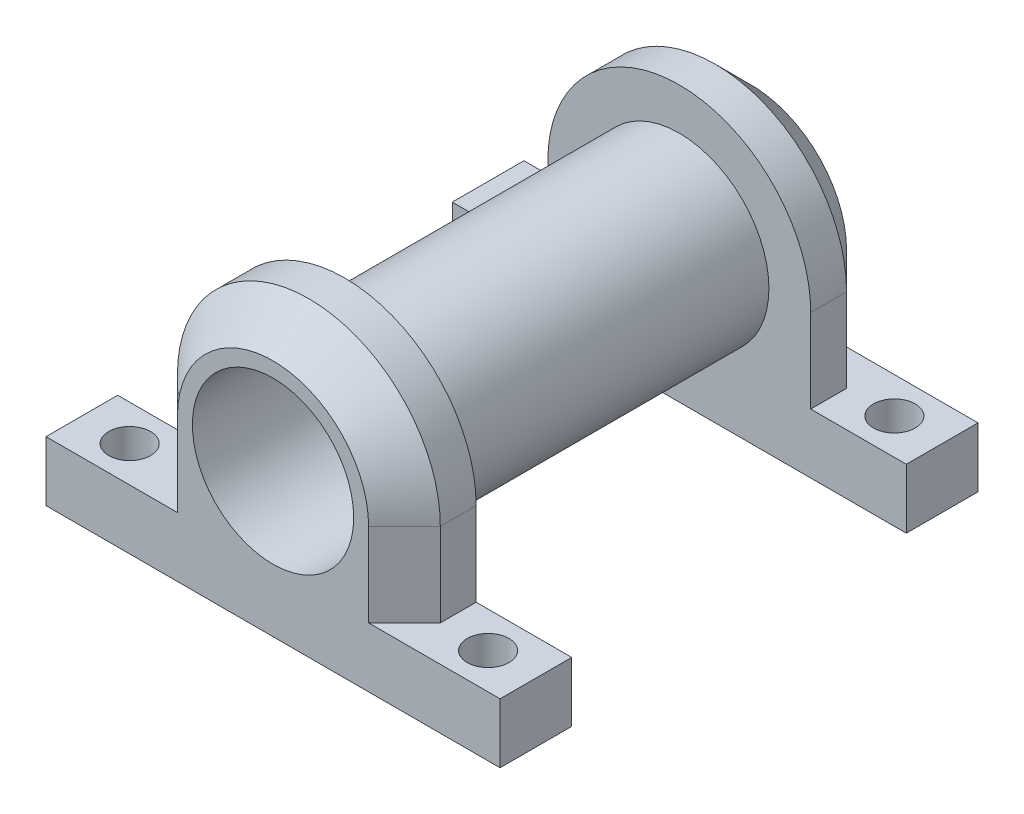
ISO-10303-21;
HEADER;
FILE_DESCRIPTION(('STEP AP214'),'2;1');
FILE_NAME('part.step','',(''),(''),'','','');
FILE_SCHEMA(('AUTOMOTIVE_DESIGN { 1 0 10303 214 1 1 1 1 }'));
ENDSEC;
DATA;
#1=APPLICATION_CONTEXT('core data for automotive mechanical design processes');
#2=APPLICATION_PROTOCOL_DEFINITION('international standard','automotive_design',2000,#1);
#3=PRODUCT_CONTEXT('',#1,'mechanical');
#4=PRODUCT('Part','Part','',(#3));
#5=PRODUCT_RELATED_PRODUCT_CATEGORY('part','',(#4));
#6=PRODUCT_DEFINITION_FORMATION('','',#4);
#7=PRODUCT_DEFINITION_CONTEXT('part definition',#1,'design');
#8=PRODUCT_DEFINITION('design','',#6,#7);
#9=PRODUCT_DEFINITION_SHAPE('','',#8);
#10=(LENGTH_UNIT() NAMED_UNIT(*) SI_UNIT(.MILLI.,.METRE.));
#11=(NAMED_UNIT(*) PLANE_ANGLE_UNIT() SI_UNIT($,.RADIAN.));
#12=(NAMED_UNIT(*) SI_UNIT($,.STERADIAN.) SOLID_ANGLE_UNIT());
#13=UNCERTAINTY_MEASURE_WITH_UNIT(LENGTH_MEASURE(1.E-05),#10,'distance_accuracy_value','');
#14=(GEOMETRIC_REPRESENTATION_CONTEXT(3) GLOBAL_UNCERTAINTY_ASSIGNED_CONTEXT((#13)) GLOBAL_UNIT_ASSIGNED_CONTEXT((#10,
#11,#12)) REPRESENTATION_CONTEXT('',''));
#15=CARTESIAN_POINT('',(0.,0.,0.));
#16=DIRECTION('',(0.,0.,1.));
#17=DIRECTION('',(1.,0.,0.));
#18=AXIS2_PLACEMENT_3D('',#15,#16,#17);
#19=CARTESIAN_POINT('',(-19.,-12.,6.));
#20=DIRECTION('',(1.,0.,0.));
#21=DIRECTION('',(0.,1.,0.));
#22=AXIS2_PLACEMENT_3D('',#19,#20,#21);
#23=PLANE('',#22);
#24=DIRECTION('',(0.,-1.,0.));
#25=VECTOR('',#24,1.);
#26=CARTESIAN_POINT('',(-19.,-12.,0.));
#27=LINE('',#26,#25);
#28=CARTESIAN_POINT('',(-19.,-7.,0.));
#29=VERTEX_POINT('',#28);
#30=CARTESIAN_POINT('',(-19.,-12.,0.));
#31=VERTEX_POINT('',#30);
#32=EDGE_CURVE('E216',#29,#31,#27,.T.);
#33=ORIENTED_EDGE('',*,*,#32,.T.);
#34=DIRECTION('',(0.,0.,-1.));
#35=VECTOR('',#34,1.);
#36=CARTESIAN_POINT('',(-19.,-12.,6.));
#37=LINE('',#36,#35);
#38=CARTESIAN_POINT('',(-19.,-12.,6.));
#39=VERTEX_POINT('',#38);
#40=EDGE_CURVE('E263',#39,#31,#37,.T.);
#41=ORIENTED_EDGE('',*,*,#40,.F.);
#42=DIRECTION('',(0.,-1.,0.));
#43=VECTOR('',#42,1.);
#44=CARTESIAN_POINT('',(-19.,-12.,6.));
#45=LINE('',#44,#43);
#46=CARTESIAN_POINT('',(-19.,-7.,6.));
#47=VERTEX_POINT('',#46);
#48=EDGE_CURVE('E218',#47,#39,#45,.T.);
#49=ORIENTED_EDGE('',*,*,#48,.F.);
#50=DIRECTION('',(0.,0.,-1.));
#51=VECTOR('',#50,1.);
#52=CARTESIAN_POINT('',(-19.,-7.,6.));
#53=LINE('',#52,#51);
#54=EDGE_CURVE('E236',#47,#29,#53,.T.);
#55=ORIENTED_EDGE('',*,*,#54,.T.);
#56=EDGE_LOOP('',(#33,#41,#49,#55));
#57=FACE_BOUND('',#56,.T.);
#58=ADVANCED_FACE('F39',(#57),#23,.F.);
#59=CARTESIAN_POINT('',(11.,-12.,6.));
#60=DIRECTION('',(0.,1.,0.));
#61=DIRECTION('',(-1.,0.,0.));
#62=AXIS2_PLACEMENT_3D('',#59,#60,#61);
#63=PLANE('',#62);
#64=CARTESIAN_POINT('',(15.,-12.,3.));
#65=DIRECTION('',(0.,1.,0.));
#66=DIRECTION('',(0.,0.,1.));
#67=AXIS2_PLACEMENT_3D('',#64,#65,#66);
#68=CIRCLE('',#67,1.75);
#69=CARTESIAN_POINT('',(15.,-12.,4.75));
#70=VERTEX_POINT('',#69);
#71=EDGE_CURVE('E732',#70,#70,#68,.T.);
#72=ORIENTED_EDGE('',*,*,#71,.T.);
#73=EDGE_LOOP('',(#72));
#74=FACE_BOUND('',#73,.T.);
#75=CARTESIAN_POINT('',(-15.,-12.,3.));
#76=DIRECTION('',(0.,1.,0.));
#77=DIRECTION('',(0.,0.,1.));
#78=AXIS2_PLACEMENT_3D('',#75,#76,#77);
#79=CIRCLE('',#78,1.75);
#80=CARTESIAN_POINT('',(-15.,-12.,4.75));
#81=VERTEX_POINT('',#80);
#82=EDGE_CURVE('E735',#81,#81,#79,.T.);
#83=ORIENTED_EDGE('',*,*,#82,.T.);
#84=EDGE_LOOP('',(#83));
#85=FACE_BOUND('',#84,.T.);
#86=DIRECTION('',(1.,0.,0.));
#87=VECTOR('',#86,1.);
#88=CARTESIAN_POINT('',(11.,-12.,0.));
#89=LINE('',#88,#87);
#90=CARTESIAN_POINT('',(19.,-12.,0.));
#91=VERTEX_POINT('',#90);
#92=EDGE_CURVE('E239',#31,#91,#89,.T.);
#93=ORIENTED_EDGE('',*,*,#92,.T.);
#94=DIRECTION('',(0.,0.,-1.));
#95=VECTOR('',#94,1.);
#96=CARTESIAN_POINT('',(19.,-12.,6.));
#97=LINE('',#96,#95);
#98=CARTESIAN_POINT('',(19.,-12.,6.));
#99=VERTEX_POINT('',#98);
#100=EDGE_CURVE('E260',#99,#91,#97,.T.);
#101=ORIENTED_EDGE('',*,*,#100,.F.);
#102=DIRECTION('',(1.,0.,0.));
#103=VECTOR('',#102,1.);
#104=CARTESIAN_POINT('',(-11.,-12.,6.));
#105=LINE('',#104,#103);
#106=EDGE_CURVE('E221',#39,#99,#105,.T.);
#107=ORIENTED_EDGE('',*,*,#106,.F.);
#108=ORIENTED_EDGE('',*,*,#40,.T.);
#109=EDGE_LOOP('',(#93,#101,#107,#108));
#110=FACE_BOUND('',#109,.T.);
#111=ADVANCED_FACE('F338',(#74,#85,#110),#63,.F.);
#112=CARTESIAN_POINT('',(19.,-12.,6.));
#113=DIRECTION('',(-1.,0.,0.));
#114=DIRECTION('',(0.,-1.,0.));
#115=AXIS2_PLACEMENT_3D('',#112,#113,#114);
#116=PLANE('',#115);
#117=DIRECTION('',(0.,1.,0.));
#118=VECTOR('',#117,1.);
#119=CARTESIAN_POINT('',(19.,-12.,0.));
#120=LINE('',#119,#118);
#121=CARTESIAN_POINT('',(19.,-7.,0.));
#122=VERTEX_POINT('',#121);
#123=EDGE_CURVE('E241',#91,#122,#120,.T.);
#124=ORIENTED_EDGE('',*,*,#123,.T.);
#125=DIRECTION('',(0.,0.,-1.));
#126=VECTOR('',#125,1.);
#127=CARTESIAN_POINT('',(19.,-7.,6.));
#128=LINE('',#127,#126);
#129=CARTESIAN_POINT('',(19.,-7.,6.));
#130=VERTEX_POINT('',#129);
#131=EDGE_CURVE('E257',#130,#122,#128,.T.);
#132=ORIENTED_EDGE('',*,*,#131,.F.);
#133=DIRECTION('',(0.,1.,0.));
#134=VECTOR('',#133,1.);
#135=CARTESIAN_POINT('',(19.,-12.,6.));
#136=LINE('',#135,#134);
#137=EDGE_CURVE('E224',#99,#130,#136,.T.);
#138=ORIENTED_EDGE('',*,*,#137,.F.);
#139=ORIENTED_EDGE('',*,*,#100,.T.);
#140=EDGE_LOOP('',(#124,#132,#138,#139));
#141=FACE_BOUND('',#140,.T.);
#142=ADVANCED_FACE('F344',(#141),#116,.F.);
#143=CARTESIAN_POINT('',(11.,-7.,6.));
#144=DIRECTION('',(0.,-1.,0.));
#145=DIRECTION('',(0.,0.,-1.));
#146=AXIS2_PLACEMENT_3D('',#143,#144,#145);
#147=PLANE('',#146);
#148=CARTESIAN_POINT('',(15.,-7.,3.));
#149=DIRECTION('',(0.,1.,0.));
#150=DIRECTION('',(0.,0.,1.));
#151=AXIS2_PLACEMENT_3D('',#148,#149,#150);
#152=CIRCLE('',#151,1.75);
#153=CARTESIAN_POINT('',(15.,-7.,4.75));
#154=VERTEX_POINT('',#153);
#155=EDGE_CURVE('E729',#154,#154,#152,.T.);
#156=ORIENTED_EDGE('',*,*,#155,.F.);
#157=EDGE_LOOP('',(#156));
#158=FACE_BOUND('',#157,.T.);
#159=DIRECTION('',(-1.,0.,0.));
#160=VECTOR('',#159,1.);
#161=CARTESIAN_POINT('',(11.,-7.,0.));
#162=LINE('',#161,#160);
#163=CARTESIAN_POINT('',(7.99999999999998,-7.,0.));
#164=VERTEX_POINT('',#163);
#165=EDGE_CURVE('E243',#122,#164,#162,.T.);
#166=ORIENTED_EDGE('',*,*,#165,.T.);
#167=DIRECTION('',(-0.707106781186549,0.,-0.707106781186546));
#168=VECTOR('',#167,1.);
#169=CARTESIAN_POINT('',(12.5,-7.,4.49999999999999));
#170=LINE('',#169,#168);
#171=CARTESIAN_POINT('',(11.,-7.,3.));
#172=VERTEX_POINT('',#171);
#173=EDGE_CURVE('E49',#164,#172,#170,.F.);
#174=ORIENTED_EDGE('',*,*,#173,.T.);
#175=DIRECTION('',(0.,0.,-1.));
#176=VECTOR('',#175,1.);
#177=CARTESIAN_POINT('',(11.,-7.,6.));
#178=LINE('',#177,#176);
#179=CARTESIAN_POINT('',(11.,-7.,6.));
#180=VERTEX_POINT('',#179);
#181=EDGE_CURVE('E254',#180,#172,#178,.T.);
#182=ORIENTED_EDGE('',*,*,#181,.F.);
#183=DIRECTION('',(-1.,0.,0.));
#184=VECTOR('',#183,1.);
#185=CARTESIAN_POINT('',(11.,-7.,6.));
#186=LINE('',#185,#184);
#187=EDGE_CURVE('E226',#130,#180,#186,.T.);
#188=ORIENTED_EDGE('',*,*,#187,.F.);
#189=ORIENTED_EDGE('',*,*,#131,.T.);
#190=EDGE_LOOP('',(#166,#174,#182,#188,#189));
#191=FACE_BOUND('',#190,.T.);
#192=ADVANCED_FACE('F334',(#158,#191),#147,.F.);
#193=CARTESIAN_POINT('',(11.,-7.,6.));
#194=DIRECTION('',(-1.,0.,0.));
#195=DIRECTION('',(0.,0.,1.));
#196=AXIS2_PLACEMENT_3D('',#193,#194,#195);
#197=PLANE('',#196);
#198=ORIENTED_EDGE('',*,*,#181,.T.);
#199=DIRECTION('',(0.,1.,0.));
#200=VECTOR('',#199,1.);
#201=CARTESIAN_POINT('',(11.,-7.,3.));
#202=LINE('',#201,#200);
#203=CARTESIAN_POINT('',(11.,0.,3.));
#204=VERTEX_POINT('',#203);
#205=EDGE_CURVE('E278',#172,#204,#202,.T.);
#206=ORIENTED_EDGE('',*,*,#205,.T.);
#207=DIRECTION('',(0.,0.,-1.));
#208=VECTOR('',#207,1.);
#209=CARTESIAN_POINT('',(11.,0.,6.));
#210=LINE('',#209,#208);
#211=CARTESIAN_POINT('',(11.,0.,6.));
#212=VERTEX_POINT('',#211);
#213=EDGE_CURVE('E252',#212,#204,#210,.T.);
#214=ORIENTED_EDGE('',*,*,#213,.F.);
#215=DIRECTION('',(0.,1.,0.));
#216=VECTOR('',#215,1.);
#217=CARTESIAN_POINT('',(11.,-7.,6.));
#218=LINE('',#217,#216);
#219=EDGE_CURVE('E228',#180,#212,#218,.T.);
#220=ORIENTED_EDGE('',*,*,#219,.F.);
#221=EDGE_LOOP('',(#198,#206,#214,#220));
#222=FACE_BOUND('',#221,.T.);
#223=ADVANCED_FACE('F327',(#222),#197,.F.);
#224=CARTESIAN_POINT('',(0.,0.,6.));
#225=DIRECTION('',(0.,0.,-1.));
#226=DIRECTION('',(-1.,0.,0.));
#227=AXIS2_PLACEMENT_3D('',#224,#225,#226);
#228=CYLINDRICAL_SURFACE('',#227,11.);
#229=ORIENTED_EDGE('',*,*,#213,.T.);
#230=CARTESIAN_POINT('',(0.,0.,3.));
#231=DIRECTION('',(0.,0.,1.));
#232=DIRECTION('',(1.,0.,0.));
#233=AXIS2_PLACEMENT_3D('',#230,#231,#232);
#234=CIRCLE('',#233,11.);
#235=CARTESIAN_POINT('',(-11.,0.,3.));
#236=VERTEX_POINT('',#235);
#237=EDGE_CURVE('E65',#204,#236,#234,.T.);
#238=ORIENTED_EDGE('',*,*,#237,.T.);
#239=DIRECTION('',(0.,0.,-1.));
#240=VECTOR('',#239,1.);
#241=CARTESIAN_POINT('',(-11.,0.,6.));
#242=LINE('',#241,#240);
#243=CARTESIAN_POINT('',(-11.,0.,6.));
#244=VERTEX_POINT('',#243);
#245=EDGE_CURVE('E250',#244,#236,#242,.T.);
#246=ORIENTED_EDGE('',*,*,#245,.F.);
#247=CARTESIAN_POINT('',(0.,0.,6.));
#248=DIRECTION('',(0.,0.,1.));
#249=DIRECTION('',(1.,0.,0.));
#250=AXIS2_PLACEMENT_3D('',#247,#248,#249);
#251=CIRCLE('',#250,11.);
#252=EDGE_CURVE('E230',#212,#244,#251,.T.);
#253=ORIENTED_EDGE('',*,*,#252,.F.);
#254=EDGE_LOOP('',(#229,#238,#246,#253));
#255=FACE_BOUND('',#254,.T.);
#256=ADVANCED_FACE('F325',(#255),#228,.T.);
#257=CARTESIAN_POINT('',(-11.,0.,6.));
#258=DIRECTION('',(1.,0.,0.));
#259=DIRECTION('',(0.,0.,-1.));
#260=AXIS2_PLACEMENT_3D('',#257,#258,#259);
#261=PLANE('',#260);
#262=ORIENTED_EDGE('',*,*,#245,.T.);
#263=DIRECTION('',(0.,-1.,0.));
#264=VECTOR('',#263,1.);
#265=CARTESIAN_POINT('',(-11.,0.,3.));
#266=LINE('',#265,#264);
#267=CARTESIAN_POINT('',(-11.,-7.,3.));
#268=VERTEX_POINT('',#267);
#269=EDGE_CURVE('E57',#236,#268,#266,.T.);
#270=ORIENTED_EDGE('',*,*,#269,.T.);
#271=DIRECTION('',(0.,0.,-1.));
#272=VECTOR('',#271,1.);
#273=CARTESIAN_POINT('',(-11.,-7.,6.));
#274=LINE('',#273,#272);
#275=CARTESIAN_POINT('',(-11.,-7.,6.));
#276=VERTEX_POINT('',#275);
#277=EDGE_CURVE('E248',#276,#268,#274,.T.);
#278=ORIENTED_EDGE('',*,*,#277,.F.);
#279=DIRECTION('',(0.,-1.,0.));
#280=VECTOR('',#279,1.);
#281=CARTESIAN_POINT('',(-11.,0.,6.));
#282=LINE('',#281,#280);
#283=EDGE_CURVE('E232',#244,#276,#282,.T.);
#284=ORIENTED_EDGE('',*,*,#283,.F.);
#285=EDGE_LOOP('',(#262,#270,#278,#284));
#286=FACE_BOUND('',#285,.T.);
#287=ADVANCED_FACE('F319',(#286),#261,.F.);
#288=CARTESIAN_POINT('',(-11.,-7.,6.));
#289=DIRECTION('',(0.,-1.,0.));
#290=DIRECTION('',(0.,0.,-1.));
#291=AXIS2_PLACEMENT_3D('',#288,#289,#290);
#292=PLANE('',#291);
#293=CARTESIAN_POINT('',(-15.,-7.,3.));
#294=DIRECTION('',(0.,1.,0.));
#295=DIRECTION('',(0.,0.,1.));
#296=AXIS2_PLACEMENT_3D('',#293,#294,#295);
#297=CIRCLE('',#296,1.75);
#298=CARTESIAN_POINT('',(-15.,-7.,4.75));
#299=VERTEX_POINT('',#298);
#300=EDGE_CURVE('E731',#299,#299,#297,.T.);
#301=ORIENTED_EDGE('',*,*,#300,.F.);
#302=EDGE_LOOP('',(#301));
#303=FACE_BOUND('',#302,.T.);
#304=DIRECTION('',(-1.,0.,0.));
#305=VECTOR('',#304,1.);
#306=CARTESIAN_POINT('',(-11.,-7.,0.));
#307=LINE('',#306,#305);
#308=CARTESIAN_POINT('',(-7.99999999999998,-7.,0.));
#309=VERTEX_POINT('',#308);
#310=EDGE_CURVE('E222',#309,#29,#307,.T.);
#311=ORIENTED_EDGE('',*,*,#310,.T.);
#312=ORIENTED_EDGE('',*,*,#54,.F.);
#313=DIRECTION('',(-1.,0.,0.));
#314=VECTOR('',#313,1.);
#315=CARTESIAN_POINT('',(-11.,-7.,6.));
#316=LINE('',#315,#314);
#317=EDGE_CURVE('E234',#276,#47,#316,.T.);
#318=ORIENTED_EDGE('',*,*,#317,.F.);
#319=ORIENTED_EDGE('',*,*,#277,.T.);
#320=DIRECTION('',(-0.707106781186549,0.,0.707106781186546));
#321=VECTOR('',#320,1.);
#322=CARTESIAN_POINT('',(-12.5,-7.,4.49999999999999));
#323=LINE('',#322,#321);
#324=EDGE_CURVE('E11',#268,#309,#323,.F.);
#325=ORIENTED_EDGE('',*,*,#324,.T.);
#326=EDGE_LOOP('',(#311,#312,#318,#319,#325));
#327=FACE_BOUND('',#326,.T.);
#328=ADVANCED_FACE('F315',(#303,#327),#292,.F.);
#329=CARTESIAN_POINT('',(0.,0.,6.));
#330=DIRECTION('',(0.,0.,1.));
#331=DIRECTION('',(1.,0.,0.));
#332=AXIS2_PLACEMENT_3D('',#329,#330,#331);
#333=PLANE('',#332);
#334=CARTESIAN_POINT('',(0.,0.,6.));
#335=DIRECTION('',(0.,0.,1.));
#336=DIRECTION('',(1.,0.,0.));
#337=AXIS2_PLACEMENT_3D('',#334,#335,#336);
#338=CIRCLE('',#337,7.5);
#339=CARTESIAN_POINT('',(7.5,0.,6.));
#340=VERTEX_POINT('',#339);
#341=EDGE_CURVE('E206',#340,#340,#338,.T.);
#342=ORIENTED_EDGE('',*,*,#341,.F.);
#343=EDGE_LOOP('',(#342));
#344=FACE_BOUND('',#343,.T.);
#345=ORIENTED_EDGE('',*,*,#48,.T.);
#346=ORIENTED_EDGE('',*,*,#106,.T.);
#347=ORIENTED_EDGE('',*,*,#137,.T.);
#348=ORIENTED_EDGE('',*,*,#187,.T.);
#349=ORIENTED_EDGE('',*,*,#219,.T.);
#350=ORIENTED_EDGE('',*,*,#252,.T.);
#351=ORIENTED_EDGE('',*,*,#283,.T.);
#352=ORIENTED_EDGE('',*,*,#317,.T.);
#353=EDGE_LOOP('',(#345,#346,#347,#348,#349,#350,#351,#352));
#354=FACE_BOUND('',#353,.T.);
#355=ADVANCED_FACE('F321',(#344,#354),#333,.T.);
#356=CARTESIAN_POINT('',(0.,0.,0.));
#357=DIRECTION('',(0.,0.,1.));
#358=DIRECTION('',(1.,0.,0.));
#359=AXIS2_PLACEMENT_3D('',#356,#357,#358);
#360=PLANE('',#359);
#361=CARTESIAN_POINT('',(0.,0.,0.));
#362=DIRECTION('',(0.,0.,1.));
#363=DIRECTION('',(1.,0.,0.));
#364=AXIS2_PLACEMENT_3D('',#361,#362,#363);
#365=CIRCLE('',#364,6.75);
#366=CARTESIAN_POINT('',(6.75,0.,0.));
#367=VERTEX_POINT('',#366);
#368=EDGE_CURVE('E752',#367,#367,#365,.T.);
#369=ORIENTED_EDGE('',*,*,#368,.T.);
#370=EDGE_LOOP('',(#369));
#371=FACE_BOUND('',#370,.T.);
#372=DIRECTION('',(0.,-1.,0.));
#373=VECTOR('',#372,1.);
#374=CARTESIAN_POINT('',(7.99999999999998,0.,0.));
#375=LINE('',#374,#373);
#376=CARTESIAN_POINT('',(7.99999999999998,0.,0.));
#377=VERTEX_POINT('',#376);
#378=EDGE_CURVE('E285',#377,#164,#375,.T.);
#379=ORIENTED_EDGE('',*,*,#378,.T.);
#380=ORIENTED_EDGE('',*,*,#165,.F.);
#381=ORIENTED_EDGE('',*,*,#123,.F.);
#382=ORIENTED_EDGE('',*,*,#92,.F.);
#383=ORIENTED_EDGE('',*,*,#32,.F.);
#384=ORIENTED_EDGE('',*,*,#310,.F.);
#385=DIRECTION('',(0.,1.,0.));
#386=VECTOR('',#385,1.);
#387=CARTESIAN_POINT('',(-7.99999999999998,0.,0.));
#388=LINE('',#387,#386);
#389=CARTESIAN_POINT('',(-7.99999999999998,0.,0.));
#390=VERTEX_POINT('',#389);
#391=EDGE_CURVE('E281',#309,#390,#388,.T.);
#392=ORIENTED_EDGE('',*,*,#391,.T.);
#393=CARTESIAN_POINT('',(0.,0.,0.));
#394=DIRECTION('',(0.,0.,1.));
#395=DIRECTION('',(1.,0.,0.));
#396=AXIS2_PLACEMENT_3D('',#393,#394,#395);
#397=CIRCLE('',#396,7.99999999999998);
#398=EDGE_CURVE('E283',#390,#377,#397,.F.);
#399=ORIENTED_EDGE('',*,*,#398,.T.);
#400=EDGE_LOOP('',(#379,#380,#381,#382,#383,#384,#392,#399));
#401=FACE_BOUND('',#400,.T.);
#402=ADVANCED_FACE('F522',(#371,#401),#360,.F.);
#403=CARTESIAN_POINT('',(0.,0.,34.));
#404=DIRECTION('',(0.,0.,-1.));
#405=DIRECTION('',(-1.,0.,0.));
#406=AXIS2_PLACEMENT_3D('',#403,#404,#405);
#407=CYLINDRICAL_SURFACE('',#406,7.5);
#408=CARTESIAN_POINT('',(0.,0.,34.));
#409=DIRECTION('',(0.,0.,1.));
#410=DIRECTION('',(1.,0.,0.));
#411=AXIS2_PLACEMENT_3D('',#408,#409,#410);
#412=CIRCLE('',#411,7.5);
#413=CARTESIAN_POINT('',(7.5,0.,34.));
#414=VERTEX_POINT('',#413);
#415=EDGE_CURVE('E209',#414,#414,#412,.T.);
#416=ORIENTED_EDGE('',*,*,#415,.F.);
#417=EDGE_LOOP('',(#416));
#418=FACE_BOUND('',#417,.T.);
#419=ORIENTED_EDGE('',*,*,#341,.T.);
#420=EDGE_LOOP('',(#419));
#421=FACE_BOUND('',#420,.T.);
#422=ADVANCED_FACE('F514',(#418,#421),#407,.T.);
#423=CARTESIAN_POINT('',(-11.,-7.,40.));
#424=DIRECTION('',(0.,-1.,0.));
#425=DIRECTION('',(0.,0.,-1.));
#426=AXIS2_PLACEMENT_3D('',#423,#424,#425);
#427=PLANE('',#426);
#428=CARTESIAN_POINT('',(-14.9999999999996,-7.,37.));
#429=DIRECTION('',(0.,1.,0.));
#430=DIRECTION('',(0.,0.,1.));
#431=AXIS2_PLACEMENT_3D('',#428,#429,#430);
#432=CIRCLE('',#431,1.75);
#433=CARTESIAN_POINT('',(-14.9999999999996,-7.,38.75));
#434=VERTEX_POINT('',#433);
#435=EDGE_CURVE('E738',#434,#434,#432,.T.);
#436=ORIENTED_EDGE('',*,*,#435,.F.);
#437=EDGE_LOOP('',(#436));
#438=FACE_BOUND('',#437,.T.);
#439=DIRECTION('',(-1.,0.,0.));
#440=VECTOR('',#439,1.);
#441=CARTESIAN_POINT('',(-11.,-7.,34.));
#442=LINE('',#441,#440);
#443=CARTESIAN_POINT('',(-11.,-7.,34.));
#444=VERTEX_POINT('',#443);
#445=CARTESIAN_POINT('',(-19.,-7.,34.));
#446=VERTEX_POINT('',#445);
#447=EDGE_CURVE('E205',#444,#446,#442,.T.);
#448=ORIENTED_EDGE('',*,*,#447,.T.);
#449=DIRECTION('',(0.,0.,-1.));
#450=VECTOR('',#449,1.);
#451=CARTESIAN_POINT('',(-19.,-7.,40.));
#452=LINE('',#451,#450);
#453=CARTESIAN_POINT('',(-19.,-7.,40.));
#454=VERTEX_POINT('',#453);
#455=EDGE_CURVE('E186',#454,#446,#452,.T.);
#456=ORIENTED_EDGE('',*,*,#455,.F.);
#457=DIRECTION('',(-1.,0.,0.));
#458=VECTOR('',#457,1.);
#459=CARTESIAN_POINT('',(-11.,-7.,40.));
#460=LINE('',#459,#458);
#461=CARTESIAN_POINT('',(-8.,-7.,40.));
#462=VERTEX_POINT('',#461);
#463=EDGE_CURVE('E193',#462,#454,#460,.T.);
#464=ORIENTED_EDGE('',*,*,#463,.F.);
#465=DIRECTION('',(-0.707106781186546,0.,-0.707106781186549));
#466=VECTOR('',#465,1.);
#467=CARTESIAN_POINT('',(-9.49999999999999,-7.,38.5));
#468=LINE('',#467,#466);
#469=CARTESIAN_POINT('',(-11.,-7.,37.));
#470=VERTEX_POINT('',#469);
#471=EDGE_CURVE('E293',#462,#470,#468,.T.);
#472=ORIENTED_EDGE('',*,*,#471,.T.);
#473=DIRECTION('',(0.,0.,-1.));
#474=VECTOR('',#473,1.);
#475=CARTESIAN_POINT('',(-11.,-7.,40.));
#476=LINE('',#475,#474);
#477=EDGE_CURVE('E762',#470,#444,#476,.T.);
#478=ORIENTED_EDGE('',*,*,#477,.T.);
#479=EDGE_LOOP('',(#448,#456,#464,#472,#478));
#480=FACE_BOUND('',#479,.T.);
#481=ADVANCED_FACE('F203',(#438,#480),#427,.F.);
#482=CARTESIAN_POINT('',(-19.,-7.,40.));
#483=DIRECTION('',(1.,0.,0.));
#484=DIRECTION('',(0.,1.,0.));
#485=AXIS2_PLACEMENT_3D('',#482,#483,#484);
#486=PLANE('',#485);
#487=DIRECTION('',(0.,-1.,0.));
#488=VECTOR('',#487,1.);
#489=CARTESIAN_POINT('',(-19.,-7.,34.));
#490=LINE('',#489,#488);
#491=CARTESIAN_POINT('',(-19.,-12.,34.));
#492=VERTEX_POINT('',#491);
#493=EDGE_CURVE('E764',#446,#492,#490,.T.);
#494=ORIENTED_EDGE('',*,*,#493,.T.);
#495=DIRECTION('',(0.,0.,-1.));
#496=VECTOR('',#495,1.);
#497=CARTESIAN_POINT('',(-19.,-12.,40.));
#498=LINE('',#497,#496);
#499=CARTESIAN_POINT('',(-19.,-12.,40.));
#500=VERTEX_POINT('',#499);
#501=EDGE_CURVE('E189',#500,#492,#498,.T.);
#502=ORIENTED_EDGE('',*,*,#501,.F.);
#503=DIRECTION('',(0.,-1.,0.));
#504=VECTOR('',#503,1.);
#505=CARTESIAN_POINT('',(-19.,-7.,40.));
#506=LINE('',#505,#504);
#507=EDGE_CURVE('E182',#454,#500,#506,.T.);
#508=ORIENTED_EDGE('',*,*,#507,.F.);
#509=ORIENTED_EDGE('',*,*,#455,.T.);
#510=EDGE_LOOP('',(#494,#502,#508,#509));
#511=FACE_BOUND('',#510,.T.);
#512=ADVANCED_FACE('F184',(#511),#486,.F.);
#513=CARTESIAN_POINT('',(-19.,-12.,40.));
#514=DIRECTION('',(0.,1.,0.));
#515=DIRECTION('',(0.,0.,1.));
#516=AXIS2_PLACEMENT_3D('',#513,#514,#515);
#517=PLANE('',#516);
#518=CARTESIAN_POINT('',(-14.9999999999996,-12.,37.));
#519=DIRECTION('',(0.,1.,0.));
#520=DIRECTION('',(0.,0.,1.));
#521=AXIS2_PLACEMENT_3D('',#518,#519,#520);
#522=CIRCLE('',#521,1.75);
#523=CARTESIAN_POINT('',(-14.9999999999996,-12.,38.75));
#524=VERTEX_POINT('',#523);
#525=EDGE_CURVE('E745',#524,#524,#522,.T.);
#526=ORIENTED_EDGE('',*,*,#525,.T.);
#527=EDGE_LOOP('',(#526));
#528=FACE_BOUND('',#527,.T.);
#529=CARTESIAN_POINT('',(15.0000000000004,-12.,37.));
#530=DIRECTION('',(0.,1.,0.));
#531=DIRECTION('',(0.,0.,1.));
#532=AXIS2_PLACEMENT_3D('',#529,#530,#531);
#533=CIRCLE('',#532,1.75);
#534=CARTESIAN_POINT('',(15.0000000000004,-12.,38.75));
#535=VERTEX_POINT('',#534);
#536=EDGE_CURVE('E300',#535,#535,#533,.T.);
#537=ORIENTED_EDGE('',*,*,#536,.T.);
#538=EDGE_LOOP('',(#537));
#539=FACE_BOUND('',#538,.T.);
#540=DIRECTION('',(1.,0.,0.));
#541=VECTOR('',#540,1.);
#542=CARTESIAN_POINT('',(-19.,-12.,34.));
#543=LINE('',#542,#541);
#544=CARTESIAN_POINT('',(19.,-12.,34.));
#545=VERTEX_POINT('',#544);
#546=EDGE_CURVE('E766',#492,#545,#543,.T.);
#547=ORIENTED_EDGE('',*,*,#546,.T.);
#548=DIRECTION('',(0.,0.,-1.));
#549=VECTOR('',#548,1.);
#550=CARTESIAN_POINT('',(19.,-12.,40.));
#551=LINE('',#550,#549);
#552=CARTESIAN_POINT('',(19.,-12.,40.));
#553=VERTEX_POINT('',#552);
#554=EDGE_CURVE('E211',#553,#545,#551,.T.);
#555=ORIENTED_EDGE('',*,*,#554,.F.);
#556=DIRECTION('',(1.,0.,0.));
#557=VECTOR('',#556,1.);
#558=CARTESIAN_POINT('',(-19.,-12.,40.));
#559=LINE('',#558,#557);
#560=EDGE_CURVE('E192',#500,#553,#559,.T.);
#561=ORIENTED_EDGE('',*,*,#560,.F.);
#562=ORIENTED_EDGE('',*,*,#501,.T.);
#563=EDGE_LOOP('',(#547,#555,#561,#562));
#564=FACE_BOUND('',#563,.T.);
#565=ADVANCED_FACE('F494',(#528,#539,#564),#517,.F.);
#566=CARTESIAN_POINT('',(19.,-12.,40.));
#567=DIRECTION('',(-1.,0.,0.));
#568=DIRECTION('',(0.,-1.,0.));
#569=AXIS2_PLACEMENT_3D('',#566,#567,#568);
#570=PLANE('',#569);
#571=DIRECTION('',(0.,1.,0.));
#572=VECTOR('',#571,1.);
#573=CARTESIAN_POINT('',(19.,-12.,34.));
#574=LINE('',#573,#572);
#575=CARTESIAN_POINT('',(19.,-7.,34.));
#576=VERTEX_POINT('',#575);
#577=EDGE_CURVE('E768',#545,#576,#574,.T.);
#578=ORIENTED_EDGE('',*,*,#577,.T.);
#579=DIRECTION('',(0.,0.,-1.));
#580=VECTOR('',#579,1.);
#581=CARTESIAN_POINT('',(19.,-7.,40.));
#582=LINE('',#581,#580);
#583=CARTESIAN_POINT('',(19.,-7.,40.));
#584=VERTEX_POINT('',#583);
#585=EDGE_CURVE('E788',#584,#576,#582,.T.);
#586=ORIENTED_EDGE('',*,*,#585,.F.);
#587=DIRECTION('',(0.,1.,0.));
#588=VECTOR('',#587,1.);
#589=CARTESIAN_POINT('',(19.,-12.,40.));
#590=LINE('',#589,#588);
#591=EDGE_CURVE('E758',#553,#584,#590,.T.);
#592=ORIENTED_EDGE('',*,*,#591,.F.);
#593=ORIENTED_EDGE('',*,*,#554,.T.);
#594=EDGE_LOOP('',(#578,#586,#592,#593));
#595=FACE_BOUND('',#594,.T.);
#596=ADVANCED_FACE('F486',(#595),#570,.F.);
#597=CARTESIAN_POINT('',(19.,-7.,40.));
#598=DIRECTION('',(0.,-1.,0.));
#599=DIRECTION('',(0.,0.,-1.));
#600=AXIS2_PLACEMENT_3D('',#597,#598,#599);
#601=PLANE('',#600);
#602=CARTESIAN_POINT('',(15.0000000000004,-7.,37.));
#603=DIRECTION('',(0.,1.,0.));
#604=DIRECTION('',(0.,0.,1.));
#605=AXIS2_PLACEMENT_3D('',#602,#603,#604);
#606=CIRCLE('',#605,1.75);
#607=CARTESIAN_POINT('',(15.0000000000004,-7.,38.75));
#608=VERTEX_POINT('',#607);
#609=EDGE_CURVE('E748',#608,#608,#606,.T.);
#610=ORIENTED_EDGE('',*,*,#609,.F.);
#611=EDGE_LOOP('',(#610));
#612=FACE_BOUND('',#611,.T.);
#613=DIRECTION('',(-1.,0.,0.));
#614=VECTOR('',#613,1.);
#615=CARTESIAN_POINT('',(19.,-7.,34.));
#616=LINE('',#615,#614);
#617=CARTESIAN_POINT('',(11.,-7.,34.));
#618=VERTEX_POINT('',#617);
#619=EDGE_CURVE('E770',#576,#618,#616,.T.);
#620=ORIENTED_EDGE('',*,*,#619,.T.);
#621=DIRECTION('',(0.,0.,-1.));
#622=VECTOR('',#621,1.);
#623=CARTESIAN_POINT('',(11.,-7.,40.));
#624=LINE('',#623,#622);
#625=CARTESIAN_POINT('',(11.,-7.,37.));
#626=VERTEX_POINT('',#625);
#627=EDGE_CURVE('E786',#626,#618,#624,.T.);
#628=ORIENTED_EDGE('',*,*,#627,.F.);
#629=DIRECTION('',(-0.707106781186546,0.,0.707106781186549));
#630=VECTOR('',#629,1.);
#631=CARTESIAN_POINT('',(13.5,-7.,34.5));
#632=LINE('',#631,#630);
#633=CARTESIAN_POINT('',(8.,-7.,40.));
#634=VERTEX_POINT('',#633);
#635=EDGE_CURVE('E290',#626,#634,#632,.T.);
#636=ORIENTED_EDGE('',*,*,#635,.T.);
#637=DIRECTION('',(-1.,0.,0.));
#638=VECTOR('',#637,1.);
#639=CARTESIAN_POINT('',(19.,-7.,40.));
#640=LINE('',#639,#638);
#641=EDGE_CURVE('E760',#584,#634,#640,.T.);
#642=ORIENTED_EDGE('',*,*,#641,.F.);
#643=ORIENTED_EDGE('',*,*,#585,.T.);
#644=EDGE_LOOP('',(#620,#628,#636,#642,#643));
#645=FACE_BOUND('',#644,.T.);
#646=ADVANCED_FACE('F478',(#612,#645),#601,.F.);
#647=CARTESIAN_POINT('',(11.,-7.,40.));
#648=DIRECTION('',(-1.,0.,0.));
#649=DIRECTION('',(0.,0.,1.));
#650=AXIS2_PLACEMENT_3D('',#647,#648,#649);
#651=PLANE('',#650);
#652=DIRECTION('',(0.,0.,-1.));
#653=VECTOR('',#652,1.);
#654=CARTESIAN_POINT('',(11.,0.,40.));
#655=LINE('',#654,#653);
#656=CARTESIAN_POINT('',(11.,0.,37.));
#657=VERTEX_POINT('',#656);
#658=CARTESIAN_POINT('',(11.,0.,34.));
#659=VERTEX_POINT('',#658);
#660=EDGE_CURVE('E784',#657,#659,#655,.T.);
#661=ORIENTED_EDGE('',*,*,#660,.F.);
#662=DIRECTION('',(0.,-1.,0.));
#663=VECTOR('',#662,1.);
#664=CARTESIAN_POINT('',(11.,-7.,37.));
#665=LINE('',#664,#663);
#666=EDGE_CURVE('E272',#657,#626,#665,.T.);
#667=ORIENTED_EDGE('',*,*,#666,.T.);
#668=ORIENTED_EDGE('',*,*,#627,.T.);
#669=DIRECTION('',(0.,1.,0.));
#670=VECTOR('',#669,1.);
#671=CARTESIAN_POINT('',(11.,-7.,34.));
#672=LINE('',#671,#670);
#673=EDGE_CURVE('E773',#618,#659,#672,.T.);
#674=ORIENTED_EDGE('',*,*,#673,.T.);
#675=EDGE_LOOP('',(#661,#667,#668,#674));
#676=FACE_BOUND('',#675,.T.);
#677=ADVANCED_FACE('F470',(#676),#651,.F.);
#678=CARTESIAN_POINT('',(0.,0.,40.));
#679=DIRECTION('',(0.,0.,-1.));
#680=DIRECTION('',(-1.,0.,0.));
#681=AXIS2_PLACEMENT_3D('',#678,#679,#680);
#682=CYLINDRICAL_SURFACE('',#681,11.);
#683=DIRECTION('',(0.,0.,-1.));
#684=VECTOR('',#683,1.);
#685=CARTESIAN_POINT('',(-11.,0.,40.));
#686=LINE('',#685,#684);
#687=CARTESIAN_POINT('',(-11.,0.,37.));
#688=VERTEX_POINT('',#687);
#689=CARTESIAN_POINT('',(-11.,0.,34.));
#690=VERTEX_POINT('',#689);
#691=EDGE_CURVE('E782',#688,#690,#686,.T.);
#692=ORIENTED_EDGE('',*,*,#691,.F.);
#693=CARTESIAN_POINT('',(0.,0.,37.));
#694=DIRECTION('',(0.,0.,1.));
#695=DIRECTION('',(1.,0.,0.));
#696=AXIS2_PLACEMENT_3D('',#693,#694,#695);
#697=CIRCLE('',#696,11.);
#698=EDGE_CURVE('E274',#688,#657,#697,.F.);
#699=ORIENTED_EDGE('',*,*,#698,.T.);
#700=ORIENTED_EDGE('',*,*,#660,.T.);
#701=CARTESIAN_POINT('',(0.,0.,34.));
#702=DIRECTION('',(0.,0.,1.));
#703=DIRECTION('',(1.,0.,0.));
#704=AXIS2_PLACEMENT_3D('',#701,#702,#703);
#705=CIRCLE('',#704,11.);
#706=EDGE_CURVE('E776',#659,#690,#705,.T.);
#707=ORIENTED_EDGE('',*,*,#706,.T.);
#708=EDGE_LOOP('',(#692,#699,#700,#707));
#709=FACE_BOUND('',#708,.T.);
#710=ADVANCED_FACE('F462',(#709),#682,.T.);
#711=CARTESIAN_POINT('',(-11.,0.,40.));
#712=DIRECTION('',(1.,0.,0.));
#713=DIRECTION('',(0.,0.,-1.));
#714=AXIS2_PLACEMENT_3D('',#711,#712,#713);
#715=PLANE('',#714);
#716=ORIENTED_EDGE('',*,*,#477,.F.);
#717=DIRECTION('',(0.,1.,0.));
#718=VECTOR('',#717,1.);
#719=CARTESIAN_POINT('',(-11.,0.,37.));
#720=LINE('',#719,#718);
#721=EDGE_CURVE('E276',#470,#688,#720,.T.);
#722=ORIENTED_EDGE('',*,*,#721,.T.);
#723=ORIENTED_EDGE('',*,*,#691,.T.);
#724=DIRECTION('',(0.,-1.,0.));
#725=VECTOR('',#724,1.);
#726=CARTESIAN_POINT('',(-11.,0.,34.));
#727=LINE('',#726,#725);
#728=EDGE_CURVE('E201',#690,#444,#727,.T.);
#729=ORIENTED_EDGE('',*,*,#728,.T.);
#730=EDGE_LOOP('',(#716,#722,#723,#729));
#731=FACE_BOUND('',#730,.T.);
#732=ADVANCED_FACE('F454',(#731),#715,.F.);
#733=CARTESIAN_POINT('',(0.,0.,40.));
#734=DIRECTION('',(0.,0.,1.));
#735=DIRECTION('',(1.,0.,0.));
#736=AXIS2_PLACEMENT_3D('',#733,#734,#735);
#737=PLANE('',#736);
#738=CARTESIAN_POINT('',(0.,0.,40.));
#739=DIRECTION('',(0.,0.,1.));
#740=DIRECTION('',(1.,0.,0.));
#741=AXIS2_PLACEMENT_3D('',#738,#739,#740);
#742=CIRCLE('',#741,6.75);
#743=CARTESIAN_POINT('',(6.75,0.,40.));
#744=VERTEX_POINT('',#743);
#745=EDGE_CURVE('E750',#744,#744,#742,.T.);
#746=ORIENTED_EDGE('',*,*,#745,.F.);
#747=EDGE_LOOP('',(#746));
#748=FACE_BOUND('',#747,.T.);
#749=ORIENTED_EDGE('',*,*,#641,.T.);
#750=DIRECTION('',(0.,1.,0.));
#751=VECTOR('',#750,1.);
#752=CARTESIAN_POINT('',(8.,0.,40.));
#753=LINE('',#752,#751);
#754=CARTESIAN_POINT('',(8.,0.,40.));
#755=VERTEX_POINT('',#754);
#756=EDGE_CURVE('E269',#634,#755,#753,.T.);
#757=ORIENTED_EDGE('',*,*,#756,.T.);
#758=CARTESIAN_POINT('',(0.,0.,40.));
#759=DIRECTION('',(0.,0.,1.));
#760=DIRECTION('',(1.,0.,0.));
#761=AXIS2_PLACEMENT_3D('',#758,#759,#760);
#762=CIRCLE('',#761,8.);
#763=CARTESIAN_POINT('',(-8.,0.,40.));
#764=VERTEX_POINT('',#763);
#765=EDGE_CURVE('E267',#755,#764,#762,.T.);
#766=ORIENTED_EDGE('',*,*,#765,.T.);
#767=DIRECTION('',(0.,-1.,0.));
#768=VECTOR('',#767,1.);
#769=CARTESIAN_POINT('',(-8.,-7.,40.));
#770=LINE('',#769,#768);
#771=EDGE_CURVE('E198',#764,#462,#770,.T.);
#772=ORIENTED_EDGE('',*,*,#771,.T.);
#773=ORIENTED_EDGE('',*,*,#463,.T.);
#774=ORIENTED_EDGE('',*,*,#507,.T.);
#775=ORIENTED_EDGE('',*,*,#560,.T.);
#776=ORIENTED_EDGE('',*,*,#591,.T.);
#777=EDGE_LOOP('',(#749,#757,#766,#772,#773,#774,#775,#776));
#778=FACE_BOUND('',#777,.T.);
#779=ADVANCED_FACE('F196',(#748,#778),#737,.T.);
#780=CARTESIAN_POINT('',(0.,0.,34.));
#781=DIRECTION('',(0.,0.,1.));
#782=DIRECTION('',(1.,0.,0.));
#783=AXIS2_PLACEMENT_3D('',#780,#781,#782);
#784=PLANE('',#783);
#785=ORIENTED_EDGE('',*,*,#415,.T.);
#786=EDGE_LOOP('',(#785));
#787=FACE_BOUND('',#786,.T.);
#788=ORIENTED_EDGE('',*,*,#447,.F.);
#789=ORIENTED_EDGE('',*,*,#728,.F.);
#790=ORIENTED_EDGE('',*,*,#706,.F.);
#791=ORIENTED_EDGE('',*,*,#673,.F.);
#792=ORIENTED_EDGE('',*,*,#619,.F.);
#793=ORIENTED_EDGE('',*,*,#577,.F.);
#794=ORIENTED_EDGE('',*,*,#546,.F.);
#795=ORIENTED_EDGE('',*,*,#493,.F.);
#796=EDGE_LOOP('',(#788,#789,#790,#791,#792,#793,#794,#795));
#797=FACE_BOUND('',#796,.T.);
#798=ADVANCED_FACE('F438',(#787,#797),#784,.F.);
#799=CARTESIAN_POINT('',(0.,0.,0.));
#800=DIRECTION('',(0.,0.,1.));
#801=DIRECTION('',(1.,0.,0.));
#802=AXIS2_PLACEMENT_3D('',#799,#800,#801);
#803=CYLINDRICAL_SURFACE('',#802,6.75);
#804=ORIENTED_EDGE('',*,*,#368,.F.);
#805=EDGE_LOOP('',(#804));
#806=FACE_BOUND('',#805,.T.);
#807=ORIENTED_EDGE('',*,*,#745,.T.);
#808=EDGE_LOOP('',(#807));
#809=FACE_BOUND('',#808,.T.);
#810=ADVANCED_FACE('F429',(#806,#809),#803,.F.);
#811=CARTESIAN_POINT('',(15.0000000000004,-12.,37.));
#812=DIRECTION('',(0.,1.,0.));
#813=DIRECTION('',(0.,0.,1.));
#814=AXIS2_PLACEMENT_3D('',#811,#812,#813);
#815=CYLINDRICAL_SURFACE('',#814,1.75);
#816=ORIENTED_EDGE('',*,*,#536,.F.);
#817=EDGE_LOOP('',(#816));
#818=FACE_BOUND('',#817,.T.);
#819=ORIENTED_EDGE('',*,*,#609,.T.);
#820=EDGE_LOOP('',(#819));
#821=FACE_BOUND('',#820,.T.);
#822=ADVANCED_FACE('F421',(#818,#821),#815,.F.);
#823=CARTESIAN_POINT('',(-14.9999999999996,-12.,37.));
#824=DIRECTION('',(0.,1.,0.));
#825=DIRECTION('',(0.,0.,1.));
#826=AXIS2_PLACEMENT_3D('',#823,#824,#825);
#827=CYLINDRICAL_SURFACE('',#826,1.75);
#828=ORIENTED_EDGE('',*,*,#525,.F.);
#829=EDGE_LOOP('',(#828));
#830=FACE_BOUND('',#829,.T.);
#831=ORIENTED_EDGE('',*,*,#435,.T.);
#832=EDGE_LOOP('',(#831));
#833=FACE_BOUND('',#832,.T.);
#834=ADVANCED_FACE('F413',(#830,#833),#827,.F.);
#835=CARTESIAN_POINT('',(-15.,-12.,3.));
#836=DIRECTION('',(0.,1.,0.));
#837=DIRECTION('',(0.,0.,1.));
#838=AXIS2_PLACEMENT_3D('',#835,#836,#837);
#839=CYLINDRICAL_SURFACE('',#838,1.75);
#840=ORIENTED_EDGE('',*,*,#82,.F.);
#841=EDGE_LOOP('',(#840));
#842=FACE_BOUND('',#841,.T.);
#843=ORIENTED_EDGE('',*,*,#300,.T.);
#844=EDGE_LOOP('',(#843));
#845=FACE_BOUND('',#844,.T.);
#846=ADVANCED_FACE('F404',(#842,#845),#839,.F.);
#847=CARTESIAN_POINT('',(15.,-12.,3.));
#848=DIRECTION('',(0.,1.,0.));
#849=DIRECTION('',(0.,0.,1.));
#850=AXIS2_PLACEMENT_3D('',#847,#848,#849);
#851=CYLINDRICAL_SURFACE('',#850,1.75);
#852=ORIENTED_EDGE('',*,*,#71,.F.);
#853=EDGE_LOOP('',(#852));
#854=FACE_BOUND('',#853,.T.);
#855=ORIENTED_EDGE('',*,*,#155,.T.);
#856=EDGE_LOOP('',(#855));
#857=FACE_BOUND('',#856,.T.);
#858=ADVANCED_FACE('F369',(#854,#857),#851,.F.);
#859=CARTESIAN_POINT('',(-8.,0.,40.));
#860=DIRECTION('',(-0.707106781186549,0.,0.707106781186546));
#861=DIRECTION('',(0.,1.,0.));
#862=AXIS2_PLACEMENT_3D('',#859,#860,#861);
#863=PLANE('',#862);
#864=ORIENTED_EDGE('',*,*,#471,.F.);
#865=ORIENTED_EDGE('',*,*,#771,.F.);
#866=DIRECTION('',(0.707106781186546,0.,0.707106781186549));
#867=VECTOR('',#866,1.);
#868=CARTESIAN_POINT('',(-11.,0.,37.));
#869=LINE('',#868,#867);
#870=EDGE_CURVE('E298',#688,#764,#869,.T.);
#871=ORIENTED_EDGE('',*,*,#870,.F.);
#872=ORIENTED_EDGE('',*,*,#721,.F.);
#873=EDGE_LOOP('',(#864,#865,#871,#872));
#874=FACE_BOUND('',#873,.T.);
#875=ADVANCED_FACE('F363',(#874),#863,.T.);
#876=CARTESIAN_POINT('',(0.,0.,40.));
#877=DIRECTION('',(0.,0.,-1.));
#878=DIRECTION('',(-1.,0.,0.));
#879=AXIS2_PLACEMENT_3D('',#876,#877,#878);
#880=CONICAL_SURFACE('',#879,8.,0.785398163397446);
#881=ORIENTED_EDGE('',*,*,#870,.T.);
#882=ORIENTED_EDGE('',*,*,#765,.F.);
#883=DIRECTION('',(-0.707106781186546,0.,0.707106781186549));
#884=VECTOR('',#883,1.);
#885=CARTESIAN_POINT('',(11.,0.,37.));
#886=LINE('',#885,#884);
#887=EDGE_CURVE('E296',#657,#755,#886,.T.);
#888=ORIENTED_EDGE('',*,*,#887,.F.);
#889=ORIENTED_EDGE('',*,*,#698,.F.);
#890=EDGE_LOOP('',(#881,#882,#888,#889));
#891=FACE_BOUND('',#890,.T.);
#892=ADVANCED_FACE('F356',(#891),#880,.T.);
#893=CARTESIAN_POINT('',(8.,0.,40.));
#894=DIRECTION('',(0.707106781186549,0.,0.707106781186546));
#895=DIRECTION('',(0.,-1.,0.));
#896=AXIS2_PLACEMENT_3D('',#893,#894,#895);
#897=PLANE('',#896);
#898=ORIENTED_EDGE('',*,*,#635,.F.);
#899=ORIENTED_EDGE('',*,*,#666,.F.);
#900=ORIENTED_EDGE('',*,*,#887,.T.);
#901=ORIENTED_EDGE('',*,*,#756,.F.);
#902=EDGE_LOOP('',(#898,#899,#900,#901));
#903=FACE_BOUND('',#902,.T.);
#904=ADVANCED_FACE('F350',(#903),#897,.T.);
#905=CARTESIAN_POINT('',(-11.,0.,3.));
#906=DIRECTION('',(0.707106781186546,0.,0.707106781186549));
#907=DIRECTION('',(0.,-1.,0.));
#908=AXIS2_PLACEMENT_3D('',#905,#906,#907);
#909=PLANE('',#908);
#910=ORIENTED_EDGE('',*,*,#324,.F.);
#911=ORIENTED_EDGE('',*,*,#269,.F.);
#912=DIRECTION('',(-0.707106781186549,0.,0.707106781186546));
#913=VECTOR('',#912,1.);
#914=CARTESIAN_POINT('',(-7.99999999999998,0.,0.));
#915=LINE('',#914,#913);
#916=EDGE_CURVE('E44',#390,#236,#915,.T.);
#917=ORIENTED_EDGE('',*,*,#916,.F.);
#918=ORIENTED_EDGE('',*,*,#391,.F.);
#919=EDGE_LOOP('',(#910,#911,#917,#918));
#920=FACE_BOUND('',#919,.T.);
#921=ADVANCED_FACE('F42',(#920),#909,.F.);
#922=CARTESIAN_POINT('',(0.,0.,3.));
#923=DIRECTION('',(0.,0.,1.));
#924=DIRECTION('',(1.,0.,0.));
#925=AXIS2_PLACEMENT_3D('',#922,#923,#924);
#926=CONICAL_SURFACE('',#925,11.,0.785398163397451);
#927=ORIENTED_EDGE('',*,*,#916,.T.);
#928=ORIENTED_EDGE('',*,*,#237,.F.);
#929=DIRECTION('',(0.707106781186549,0.,0.707106781186546));
#930=VECTOR('',#929,1.);
#931=CARTESIAN_POINT('',(7.99999999999998,0.,0.));
#932=LINE('',#931,#930);
#933=EDGE_CURVE('E301',#377,#204,#932,.T.);
#934=ORIENTED_EDGE('',*,*,#933,.F.);
#935=ORIENTED_EDGE('',*,*,#398,.F.);
#936=EDGE_LOOP('',(#927,#928,#934,#935));
#937=FACE_BOUND('',#936,.T.);
#938=ADVANCED_FACE('F310',(#937),#926,.T.);
#939=CARTESIAN_POINT('',(11.,-7.,3.));
#940=DIRECTION('',(-0.707106781186546,0.,0.707106781186549));
#941=DIRECTION('',(0.,1.,0.));
#942=AXIS2_PLACEMENT_3D('',#939,#940,#941);
#943=PLANE('',#942);
#944=ORIENTED_EDGE('',*,*,#173,.F.);
#945=ORIENTED_EDGE('',*,*,#378,.F.);
#946=ORIENTED_EDGE('',*,*,#933,.T.);
#947=ORIENTED_EDGE('',*,*,#205,.F.);
#948=EDGE_LOOP('',(#944,#945,#946,#947));
#949=FACE_BOUND('',#948,.T.);
#950=ADVANCED_FACE('F372',(#949),#943,.F.);
#951=CLOSED_SHELL('',(#58,#111,#142,#192,#223,#256,#287,#328,#355,#402,#422,#481,#512,#565,#596,
#646,#677,#710,#732,#779,#798,#810,#822,#834,#846,#858,#875,#892,#904,#921,#938,#950));
#952=MANIFOLD_SOLID_BREP('B2',#951);
#953=ADVANCED_BREP_SHAPE_REPRESENTATION('',(#18,#952),#14);
#954=SHAPE_DEFINITION_REPRESENTATION(#9,#953);
ENDSEC;
END-ISO-10303-21;
